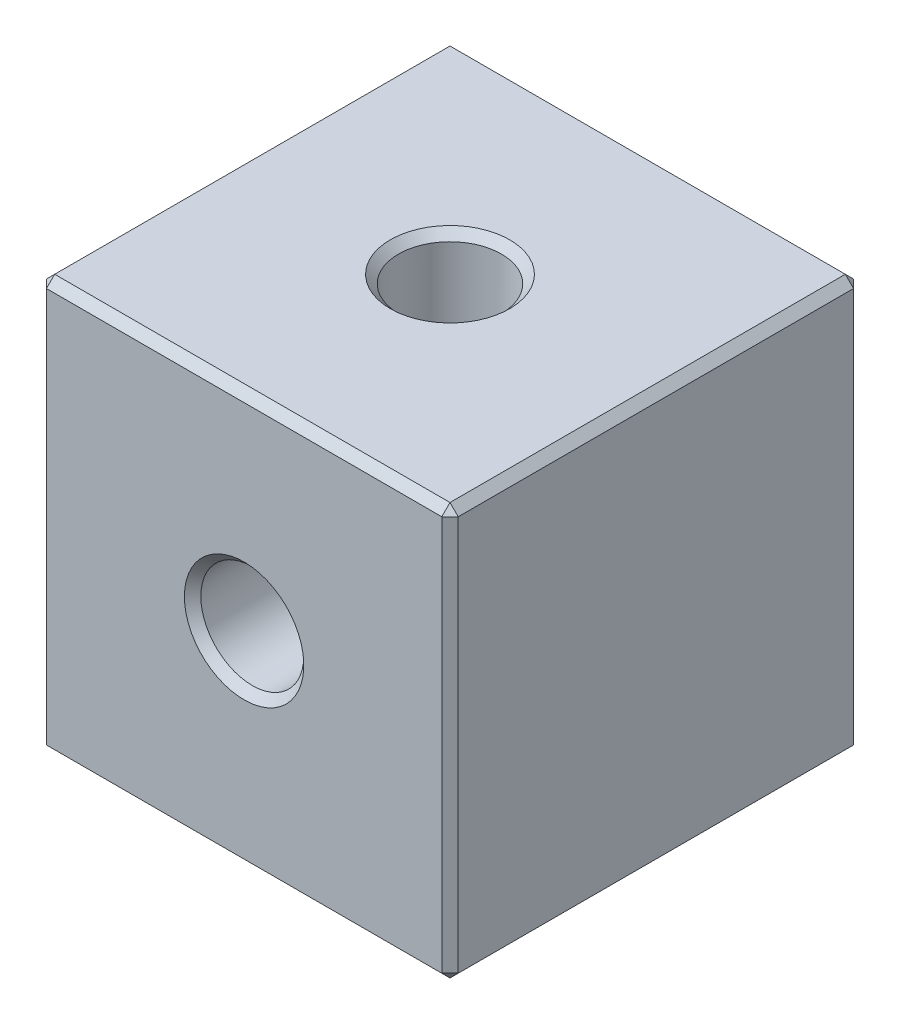
ISO-10303-21;
HEADER;
FILE_DESCRIPTION(('STEP AP214'),'2;1');
FILE_NAME('part.step','',(''),(''),'','','');
FILE_SCHEMA(('AUTOMOTIVE_DESIGN { 1 0 10303 214 1 1 1 1 }'));
ENDSEC;
DATA;
#1=APPLICATION_CONTEXT('core data for automotive mechanical design processes');
#2=APPLICATION_PROTOCOL_DEFINITION('international standard','automotive_design',2000,#1);
#3=PRODUCT_CONTEXT('',#1,'mechanical');
#4=PRODUCT('Part','Part','',(#3));
#5=PRODUCT_RELATED_PRODUCT_CATEGORY('part','',(#4));
#6=PRODUCT_DEFINITION_FORMATION('','',#4);
#7=PRODUCT_DEFINITION_CONTEXT('part definition',#1,'design');
#8=PRODUCT_DEFINITION('design','',#6,#7);
#9=PRODUCT_DEFINITION_SHAPE('','',#8);
#10=(LENGTH_UNIT() NAMED_UNIT(*) SI_UNIT(.MILLI.,.METRE.));
#11=(NAMED_UNIT(*) PLANE_ANGLE_UNIT() SI_UNIT($,.RADIAN.));
#12=(NAMED_UNIT(*) SI_UNIT($,.STERADIAN.) SOLID_ANGLE_UNIT());
#13=UNCERTAINTY_MEASURE_WITH_UNIT(LENGTH_MEASURE(1.E-05),#10,'distance_accuracy_value','');
#14=(GEOMETRIC_REPRESENTATION_CONTEXT(3) GLOBAL_UNCERTAINTY_ASSIGNED_CONTEXT((#13)) GLOBAL_UNIT_ASSIGNED_CONTEXT((#10,
#11,#12)) REPRESENTATION_CONTEXT('',''));
#15=CARTESIAN_POINT('',(0.,0.,0.));
#16=DIRECTION('',(0.,0.,1.));
#17=DIRECTION('',(1.,0.,0.));
#18=AXIS2_PLACEMENT_3D('',#15,#16,#17);
#19=CARTESIAN_POINT('',(5.,5.,-5.));
#20=DIRECTION('',(-1.,0.,0.));
#21=DIRECTION('',(0.,0.,1.));
#22=AXIS2_PLACEMENT_3D('',#19,#20,#21);
#23=PLANE('',#22);
#24=DIRECTION('',(0.,0.,-1.));
#25=VECTOR('',#24,1.);
#26=CARTESIAN_POINT('',(5.,-4.8,-5.));
#27=LINE('',#26,#25);
#28=CARTESIAN_POINT('',(5.,-4.8,4.8));
#29=VERTEX_POINT('',#28);
#30=CARTESIAN_POINT('',(5.,-4.8,-4.8));
#31=VERTEX_POINT('',#30);
#32=EDGE_CURVE('E220',#29,#31,#27,.T.);
#33=ORIENTED_EDGE('',*,*,#32,.T.);
#34=DIRECTION('',(0.,1.,0.));
#35=VECTOR('',#34,1.);
#36=CARTESIAN_POINT('',(5.,5.,-4.8));
#37=LINE('',#36,#35);
#38=CARTESIAN_POINT('',(5.,4.8,-4.8));
#39=VERTEX_POINT('',#38);
#40=EDGE_CURVE('E222',#31,#39,#37,.T.);
#41=ORIENTED_EDGE('',*,*,#40,.T.);
#42=DIRECTION('',(0.,0.,1.));
#43=VECTOR('',#42,1.);
#44=CARTESIAN_POINT('',(5.,4.8,5.));
#45=LINE('',#44,#43);
#46=CARTESIAN_POINT('',(5.,4.8,4.8));
#47=VERTEX_POINT('',#46);
#48=EDGE_CURVE('E216',#39,#47,#45,.T.);
#49=ORIENTED_EDGE('',*,*,#48,.T.);
#50=DIRECTION('',(0.,-1.,0.));
#51=VECTOR('',#50,1.);
#52=CARTESIAN_POINT('',(5.,5.,4.8));
#53=LINE('',#52,#51);
#54=EDGE_CURVE('E218',#47,#29,#53,.T.);
#55=ORIENTED_EDGE('',*,*,#54,.T.);
#56=EDGE_LOOP('',(#33,#41,#49,#55));
#57=FACE_BOUND('',#56,.T.);
#58=ADVANCED_FACE('F41',(#57),#23,.F.);
#59=CARTESIAN_POINT('',(-5.,5.,-5.));
#60=DIRECTION('',(0.,0.,1.));
#61=DIRECTION('',(1.,0.,0.));
#62=AXIS2_PLACEMENT_3D('',#59,#60,#61);
#63=PLANE('',#62);
#64=DIRECTION('',(-1.,0.,0.));
#65=VECTOR('',#64,1.);
#66=CARTESIAN_POINT('',(-5.,-4.8,-5.));
#67=LINE('',#66,#65);
#68=CARTESIAN_POINT('',(4.8,-4.8,-5.));
#69=VERTEX_POINT('',#68);
#70=CARTESIAN_POINT('',(-4.8,-4.8,-5.));
#71=VERTEX_POINT('',#70);
#72=EDGE_CURVE('E211',#69,#71,#67,.T.);
#73=ORIENTED_EDGE('',*,*,#72,.T.);
#74=DIRECTION('',(0.,1.,0.));
#75=VECTOR('',#74,1.);
#76=CARTESIAN_POINT('',(-4.8,5.,-5.));
#77=LINE('',#76,#75);
#78=CARTESIAN_POINT('',(-4.8,4.8,-5.));
#79=VERTEX_POINT('',#78);
#80=EDGE_CURVE('E213',#71,#79,#77,.T.);
#81=ORIENTED_EDGE('',*,*,#80,.T.);
#82=DIRECTION('',(1.,0.,0.));
#83=VECTOR('',#82,1.);
#84=CARTESIAN_POINT('',(5.,4.8,-5.));
#85=LINE('',#84,#83);
#86=CARTESIAN_POINT('',(4.8,4.8,-5.));
#87=VERTEX_POINT('',#86);
#88=EDGE_CURVE('E207',#79,#87,#85,.T.);
#89=ORIENTED_EDGE('',*,*,#88,.T.);
#90=DIRECTION('',(0.,-1.,0.));
#91=VECTOR('',#90,1.);
#92=CARTESIAN_POINT('',(4.8,5.,-5.));
#93=LINE('',#92,#91);
#94=EDGE_CURVE('E209',#87,#69,#93,.T.);
#95=ORIENTED_EDGE('',*,*,#94,.T.);
#96=EDGE_LOOP('',(#73,#81,#89,#95));
#97=FACE_BOUND('',#96,.T.);
#98=ADVANCED_FACE('F331',(#97),#63,.F.);
#99=CARTESIAN_POINT('',(-5.,5.,-5.));
#100=DIRECTION('',(1.,0.,0.));
#101=DIRECTION('',(0.,0.,-1.));
#102=AXIS2_PLACEMENT_3D('',#99,#100,#101);
#103=PLANE('',#102);
#104=CARTESIAN_POINT('',(-5.,0.,0.));
#105=DIRECTION('',(1.,0.,0.));
#106=DIRECTION('',(0.,0.,-1.));
#107=AXIS2_PLACEMENT_3D('',#104,#105,#106);
#108=CIRCLE('',#107,1.45);
#109=CARTESIAN_POINT('',(-5.,0.,-1.45));
#110=VERTEX_POINT('',#109);
#111=EDGE_CURVE('E180',#110,#110,#108,.T.);
#112=ORIENTED_EDGE('',*,*,#111,.T.);
#113=EDGE_LOOP('',(#112));
#114=FACE_BOUND('',#113,.T.);
#115=DIRECTION('',(0.,-1.,0.));
#116=VECTOR('',#115,1.);
#117=CARTESIAN_POINT('',(-5.,5.,-4.8));
#118=LINE('',#117,#116);
#119=CARTESIAN_POINT('',(-5.,4.8,-4.8));
#120=VERTEX_POINT('',#119);
#121=CARTESIAN_POINT('',(-5.,-4.8,-4.8));
#122=VERTEX_POINT('',#121);
#123=EDGE_CURVE('E175',#120,#122,#118,.T.);
#124=ORIENTED_EDGE('',*,*,#123,.T.);
#125=DIRECTION('',(0.,0.,1.));
#126=VECTOR('',#125,1.);
#127=CARTESIAN_POINT('',(-5.,-4.8,-5.));
#128=LINE('',#127,#126);
#129=CARTESIAN_POINT('',(-5.,-4.8,4.8));
#130=VERTEX_POINT('',#129);
#131=EDGE_CURVE('E177',#122,#130,#128,.T.);
#132=ORIENTED_EDGE('',*,*,#131,.T.);
#133=DIRECTION('',(0.,1.,0.));
#134=VECTOR('',#133,1.);
#135=CARTESIAN_POINT('',(-5.,5.,4.8));
#136=LINE('',#135,#134);
#137=CARTESIAN_POINT('',(-5.,4.8,4.8));
#138=VERTEX_POINT('',#137);
#139=EDGE_CURVE('E173',#130,#138,#136,.T.);
#140=ORIENTED_EDGE('',*,*,#139,.T.);
#141=DIRECTION('',(0.,0.,-1.));
#142=VECTOR('',#141,1.);
#143=CARTESIAN_POINT('',(-5.,4.8,-5.));
#144=LINE('',#143,#142);
#145=EDGE_CURVE('E171',#138,#120,#144,.T.);
#146=ORIENTED_EDGE('',*,*,#145,.T.);
#147=EDGE_LOOP('',(#124,#132,#140,#146));
#148=FACE_BOUND('',#147,.T.);
#149=ADVANCED_FACE('F363',(#114,#148),#103,.F.);
#150=CARTESIAN_POINT('',(-5.,5.,5.));
#151=DIRECTION('',(0.,0.,-1.));
#152=DIRECTION('',(-1.,0.,0.));
#153=AXIS2_PLACEMENT_3D('',#150,#151,#152);
#154=PLANE('',#153);
#155=CARTESIAN_POINT('',(0.,0.,5.));
#156=DIRECTION('',(0.,0.,-1.));
#157=DIRECTION('',(-1.,0.,0.));
#158=AXIS2_PLACEMENT_3D('',#155,#156,#157);
#159=CIRCLE('',#158,1.44999999999999);
#160=CARTESIAN_POINT('',(-1.44999999999999,0.,5.));
#161=VERTEX_POINT('',#160);
#162=EDGE_CURVE('E195',#161,#161,#159,.T.);
#163=ORIENTED_EDGE('',*,*,#162,.T.);
#164=EDGE_LOOP('',(#163));
#165=FACE_BOUND('',#164,.T.);
#166=DIRECTION('',(-1.,0.,0.));
#167=VECTOR('',#166,1.);
#168=CARTESIAN_POINT('',(-5.,4.8,5.));
#169=LINE('',#168,#167);
#170=CARTESIAN_POINT('',(4.8,4.8,5.));
#171=VERTEX_POINT('',#170);
#172=CARTESIAN_POINT('',(-4.8,4.8,5.));
#173=VERTEX_POINT('',#172);
#174=EDGE_CURVE('E186',#171,#173,#169,.T.);
#175=ORIENTED_EDGE('',*,*,#174,.T.);
#176=DIRECTION('',(0.,-1.,0.));
#177=VECTOR('',#176,1.);
#178=CARTESIAN_POINT('',(-4.8,5.,5.));
#179=LINE('',#178,#177);
#180=CARTESIAN_POINT('',(-4.8,-4.8,5.));
#181=VERTEX_POINT('',#180);
#182=EDGE_CURVE('E192',#173,#181,#179,.T.);
#183=ORIENTED_EDGE('',*,*,#182,.T.);
#184=DIRECTION('',(1.,0.,0.));
#185=VECTOR('',#184,1.);
#186=CARTESIAN_POINT('',(-5.,-4.8,5.));
#187=LINE('',#186,#185);
#188=CARTESIAN_POINT('',(4.8,-4.8,5.));
#189=VERTEX_POINT('',#188);
#190=EDGE_CURVE('E190',#181,#189,#187,.T.);
#191=ORIENTED_EDGE('',*,*,#190,.T.);
#192=DIRECTION('',(0.,1.,0.));
#193=VECTOR('',#192,1.);
#194=CARTESIAN_POINT('',(4.8,5.,5.));
#195=LINE('',#194,#193);
#196=EDGE_CURVE('E188',#189,#171,#195,.T.);
#197=ORIENTED_EDGE('',*,*,#196,.T.);
#198=EDGE_LOOP('',(#175,#183,#191,#197));
#199=FACE_BOUND('',#198,.T.);
#200=ADVANCED_FACE('F518',(#165,#199),#154,.F.);
#201=CARTESIAN_POINT('',(0.,5.,0.));
#202=DIRECTION('',(0.,1.,0.));
#203=DIRECTION('',(0.,0.,1.));
#204=AXIS2_PLACEMENT_3D('',#201,#202,#203);
#205=PLANE('',#204);
#206=DIRECTION('',(0.,0.,1.));
#207=VECTOR('',#206,1.);
#208=CARTESIAN_POINT('',(-4.8,5.,5.));
#209=LINE('',#208,#207);
#210=CARTESIAN_POINT('',(-4.80000000000001,5.,-4.8));
#211=VERTEX_POINT('',#210);
#212=CARTESIAN_POINT('',(-4.8,5.,4.8));
#213=VERTEX_POINT('',#212);
#214=EDGE_CURVE('E59',#211,#213,#209,.T.);
#215=ORIENTED_EDGE('',*,*,#214,.T.);
#216=DIRECTION('',(1.,0.,0.));
#217=VECTOR('',#216,1.);
#218=CARTESIAN_POINT('',(5.,5.,4.8));
#219=LINE('',#218,#217);
#220=CARTESIAN_POINT('',(4.8,5.,4.8));
#221=VERTEX_POINT('',#220);
#222=EDGE_CURVE('E51',#213,#221,#219,.T.);
#223=ORIENTED_EDGE('',*,*,#222,.T.);
#224=DIRECTION('',(0.,0.,-1.));
#225=VECTOR('',#224,1.);
#226=CARTESIAN_POINT('',(4.8,5.,-5.));
#227=LINE('',#226,#225);
#228=CARTESIAN_POINT('',(4.8,5.,-4.8));
#229=VERTEX_POINT('',#228);
#230=EDGE_CURVE('E228',#221,#229,#227,.T.);
#231=ORIENTED_EDGE('',*,*,#230,.T.);
#232=DIRECTION('',(-1.,0.,0.));
#233=VECTOR('',#232,1.);
#234=CARTESIAN_POINT('',(-5.,5.,-4.8));
#235=LINE('',#234,#233);
#236=EDGE_CURVE('E64',#229,#211,#235,.T.);
#237=ORIENTED_EDGE('',*,*,#236,.T.);
#238=EDGE_LOOP('',(#215,#223,#231,#237));
#239=FACE_BOUND('',#238,.T.);
#240=CARTESIAN_POINT('',(0.,5.,0.));
#241=DIRECTION('',(0.,1.,0.));
#242=DIRECTION('',(0.,0.,1.));
#243=AXIS2_PLACEMENT_3D('',#240,#241,#242);
#244=CIRCLE('',#243,1.44999999999999);
#245=CARTESIAN_POINT('',(0.,5.,1.44999999999999));
#246=VERTEX_POINT('',#245);
#247=EDGE_CURVE('E225',#246,#246,#244,.F.);
#248=ORIENTED_EDGE('',*,*,#247,.T.);
#249=EDGE_LOOP('',(#248));
#250=FACE_BOUND('',#249,.T.);
#251=ADVANCED_FACE('F515',(#239,#250),#205,.T.);
#252=CARTESIAN_POINT('',(0.,-5.,0.));
#253=DIRECTION('',(0.,1.,0.));
#254=DIRECTION('',(0.,0.,1.));
#255=AXIS2_PLACEMENT_3D('',#252,#253,#254);
#256=PLANE('',#255);
#257=DIRECTION('',(-1.,0.,0.));
#258=VECTOR('',#257,1.);
#259=CARTESIAN_POINT('',(0.,-5.,4.8));
#260=LINE('',#259,#258);
#261=CARTESIAN_POINT('',(4.8,-5.,4.8));
#262=VERTEX_POINT('',#261);
#263=CARTESIAN_POINT('',(-4.8,-5.,4.8));
#264=VERTEX_POINT('',#263);
#265=EDGE_CURVE('E198',#262,#264,#260,.T.);
#266=ORIENTED_EDGE('',*,*,#265,.T.);
#267=DIRECTION('',(0.,0.,-1.));
#268=VECTOR('',#267,1.);
#269=CARTESIAN_POINT('',(-4.8,-5.,0.));
#270=LINE('',#269,#268);
#271=CARTESIAN_POINT('',(-4.8,-5.,-4.8));
#272=VERTEX_POINT('',#271);
#273=EDGE_CURVE('E204',#264,#272,#270,.T.);
#274=ORIENTED_EDGE('',*,*,#273,.T.);
#275=DIRECTION('',(1.,0.,0.));
#276=VECTOR('',#275,1.);
#277=CARTESIAN_POINT('',(0.,-5.,-4.8));
#278=LINE('',#277,#276);
#279=CARTESIAN_POINT('',(4.8,-5.,-4.8));
#280=VERTEX_POINT('',#279);
#281=EDGE_CURVE('E202',#272,#280,#278,.T.);
#282=ORIENTED_EDGE('',*,*,#281,.T.);
#283=DIRECTION('',(0.,0.,1.));
#284=VECTOR('',#283,1.);
#285=CARTESIAN_POINT('',(4.8,-5.,0.));
#286=LINE('',#285,#284);
#287=EDGE_CURVE('E200',#280,#262,#286,.T.);
#288=ORIENTED_EDGE('',*,*,#287,.T.);
#289=EDGE_LOOP('',(#266,#274,#282,#288));
#290=FACE_BOUND('',#289,.T.);
#291=ADVANCED_FACE('F504',(#290),#256,.F.);
#292=CARTESIAN_POINT('',(0.,0.,5.));
#293=DIRECTION('',(0.,0.,1.));
#294=DIRECTION('',(1.,0.,0.));
#295=AXIS2_PLACEMENT_3D('',#292,#293,#294);
#296=CYLINDRICAL_SURFACE('',#295,1.24999999999999);
#297=CARTESIAN_POINT('',(0.,0.,4.80000000000001));
#298=DIRECTION('',(0.,0.,-1.));
#299=DIRECTION('',(-1.,0.,0.));
#300=AXIS2_PLACEMENT_3D('',#297,#298,#299);
#301=CIRCLE('',#300,1.24999999999999);
#302=CARTESIAN_POINT('',(-1.24999999999999,0.,4.80000000000001));
#303=VERTEX_POINT('',#302);
#304=EDGE_CURVE('E183',#303,#303,#301,.F.);
#305=ORIENTED_EDGE('',*,*,#304,.T.);
#306=EDGE_LOOP('',(#305));
#307=FACE_BOUND('',#306,.T.);
#308=CARTESIAN_POINT('',(0.,0.,0.));
#309=DIRECTION('',(0.,0.,1.));
#310=DIRECTION('',(1.,0.,0.));
#311=AXIS2_PLACEMENT_3D('',#308,#309,#310);
#312=CIRCLE('',#311,1.24999999999999);
#313=CARTESIAN_POINT('',(1.24999999999999,0.,0.));
#314=VERTEX_POINT('',#313);
#315=CARTESIAN_POINT('',(0.,-1.24999999999999,0.));
#316=VERTEX_POINT('',#315);
#317=EDGE_CURVE('E147',#314,#316,#312,.F.);
#318=ORIENTED_EDGE('',*,*,#317,.T.);
#319=CARTESIAN_POINT('',(0.,0.,0.));
#320=DIRECTION('',(0.707106781186548,0.,0.707106781186547));
#321=DIRECTION('',(-0.707106781186547,0.,0.707106781186547));
#322=AXIS2_PLACEMENT_3D('',#319,#320,#321);
#323=ELLIPSE('',#322,1.76776695296636,1.25);
#324=CARTESIAN_POINT('',(-0.883883476483181,0.883883476483181,0.883883476483181));
#325=VERTEX_POINT('',#324);
#326=EDGE_CURVE('E153',#316,#325,#323,.F.);
#327=ORIENTED_EDGE('',*,*,#326,.T.);
#328=CARTESIAN_POINT('',(0.,0.,0.));
#329=DIRECTION('',(0.,-0.707106781186547,0.707106781186547));
#330=DIRECTION('',(0.,0.707106781186547,0.707106781186547));
#331=AXIS2_PLACEMENT_3D('',#328,#329,#330);
#332=ELLIPSE('',#331,1.76776695296636,1.24999999999999);
#333=EDGE_CURVE('E162',#325,#314,#332,.F.);
#334=ORIENTED_EDGE('',*,*,#333,.T.);
#335=EDGE_LOOP('',(#318,#327,#334));
#336=FACE_BOUND('',#335,.T.);
#337=ADVANCED_FACE('F161',(#307,#336),#296,.F.);
#338=CARTESIAN_POINT('',(0.,5.,0.));
#339=DIRECTION('',(0.,1.,0.));
#340=DIRECTION('',(0.,0.,1.));
#341=AXIS2_PLACEMENT_3D('',#338,#339,#340);
#342=CYLINDRICAL_SURFACE('',#341,1.24999999999999);
#343=CARTESIAN_POINT('',(0.,4.80000000000001,0.));
#344=DIRECTION('',(0.,1.,0.));
#345=DIRECTION('',(0.,0.,1.));
#346=AXIS2_PLACEMENT_3D('',#343,#344,#345);
#347=CIRCLE('',#346,1.24999999999999);
#348=CARTESIAN_POINT('',(0.,4.80000000000001,1.24999999999999));
#349=VERTEX_POINT('',#348);
#350=EDGE_CURVE('E11',#349,#349,#347,.T.);
#351=ORIENTED_EDGE('',*,*,#350,.T.);
#352=EDGE_LOOP('',(#351));
#353=FACE_BOUND('',#352,.T.);
#354=ORIENTED_EDGE('',*,*,#333,.F.);
#355=CARTESIAN_POINT('',(0.,0.,0.));
#356=DIRECTION('',(0.707106781186547,0.707106781186547,0.));
#357=DIRECTION('',(-0.707106781186547,0.707106781186547,0.));
#358=AXIS2_PLACEMENT_3D('',#355,#356,#357);
#359=ELLIPSE('',#358,1.76776695296636,1.25);
#360=CARTESIAN_POINT('',(0.,0.,-1.25));
#361=VERTEX_POINT('',#360);
#362=EDGE_CURVE('E157',#325,#361,#359,.F.);
#363=ORIENTED_EDGE('',*,*,#362,.T.);
#364=CARTESIAN_POINT('',(0.,0.,0.));
#365=DIRECTION('',(0.,1.,0.));
#366=DIRECTION('',(0.,0.,1.));
#367=AXIS2_PLACEMENT_3D('',#364,#365,#366);
#368=CIRCLE('',#367,1.24999999999999);
#369=EDGE_CURVE('E150',#361,#314,#368,.F.);
#370=ORIENTED_EDGE('',*,*,#369,.T.);
#371=EDGE_LOOP('',(#354,#363,#370));
#372=FACE_BOUND('',#371,.T.);
#373=ADVANCED_FACE('F526',(#353,#372),#342,.F.);
#374=CARTESIAN_POINT('',(-5.,0.,0.));
#375=DIRECTION('',(-1.,0.,0.));
#376=DIRECTION('',(0.,0.,1.));
#377=AXIS2_PLACEMENT_3D('',#374,#375,#376);
#378=CYLINDRICAL_SURFACE('',#377,1.25);
#379=CARTESIAN_POINT('',(-4.8,0.,0.));
#380=DIRECTION('',(1.,0.,0.));
#381=DIRECTION('',(0.,0.,-1.));
#382=AXIS2_PLACEMENT_3D('',#379,#380,#381);
#383=CIRCLE('',#382,1.25);
#384=CARTESIAN_POINT('',(-4.8,0.,-1.25));
#385=VERTEX_POINT('',#384);
#386=EDGE_CURVE('E164',#385,#385,#383,.F.);
#387=ORIENTED_EDGE('',*,*,#386,.T.);
#388=EDGE_LOOP('',(#387));
#389=FACE_BOUND('',#388,.T.);
#390=CARTESIAN_POINT('',(0.,0.,0.));
#391=DIRECTION('',(1.,0.,0.));
#392=DIRECTION('',(0.,0.,-1.));
#393=AXIS2_PLACEMENT_3D('',#390,#391,#392);
#394=CIRCLE('',#393,1.25);
#395=EDGE_CURVE('E143',#361,#316,#394,.F.);
#396=ORIENTED_EDGE('',*,*,#395,.F.);
#397=ORIENTED_EDGE('',*,*,#362,.F.);
#398=ORIENTED_EDGE('',*,*,#326,.F.);
#399=EDGE_LOOP('',(#396,#397,#398));
#400=FACE_BOUND('',#399,.T.);
#401=ADVANCED_FACE('F156',(#389,#400),#378,.F.);
#402=CARTESIAN_POINT('',(0.,0.,0.));
#403=DIRECTION('',(1.,0.,0.));
#404=DIRECTION('',(0.,0.,1.));
#405=AXIS2_PLACEMENT_3D('',#402,#403,#404);
#406=SPHERICAL_SURFACE('',#405,1.24999999999999);
#407=ORIENTED_EDGE('',*,*,#317,.F.);
#408=ORIENTED_EDGE('',*,*,#369,.F.);
#409=ORIENTED_EDGE('',*,*,#395,.T.);
#410=EDGE_LOOP('',(#407,#408,#409));
#411=FACE_BOUND('',#410,.T.);
#412=ADVANCED_FACE('F145',(#411),#406,.F.);
#413=CARTESIAN_POINT('',(-4.8,0.,0.));
#414=DIRECTION('',(-1.,0.,0.));
#415=DIRECTION('',(0.,0.,1.));
#416=AXIS2_PLACEMENT_3D('',#413,#414,#415);
#417=CONICAL_SURFACE('',#416,1.25,0.78539816339745);
#418=ORIENTED_EDGE('',*,*,#111,.F.);
#419=EDGE_LOOP('',(#418));
#420=FACE_BOUND('',#419,.T.);
#421=ORIENTED_EDGE('',*,*,#386,.F.);
#422=EDGE_LOOP('',(#421));
#423=FACE_BOUND('',#422,.T.);
#424=ADVANCED_FACE('F368',(#420,#423),#417,.F.);
#425=CARTESIAN_POINT('',(0.,0.,4.80000000000001));
#426=DIRECTION('',(0.,0.,1.));
#427=DIRECTION('',(1.,0.,0.));
#428=AXIS2_PLACEMENT_3D('',#425,#426,#427);
#429=CONICAL_SURFACE('',#428,1.24999999999999,0.785398163397454);
#430=ORIENTED_EDGE('',*,*,#162,.F.);
#431=EDGE_LOOP('',(#430));
#432=FACE_BOUND('',#431,.T.);
#433=ORIENTED_EDGE('',*,*,#304,.F.);
#434=EDGE_LOOP('',(#433));
#435=FACE_BOUND('',#434,.T.);
#436=ADVANCED_FACE('F374',(#432,#435),#429,.F.);
#437=CARTESIAN_POINT('',(4.8,5.,0.));
#438=DIRECTION('',(0.707106781186554,0.707106781186541,0.));
#439=DIRECTION('',(0.,0.,1.));
#440=AXIS2_PLACEMENT_3D('',#437,#438,#439);
#441=PLANE('',#440);
#442=DIRECTION('',(0.707106781186541,-0.707106781186555,0.));
#443=VECTOR('',#442,1.);
#444=CARTESIAN_POINT('',(5.,4.8,-4.8));
#445=LINE('',#444,#443);
#446=EDGE_CURVE('E46',#229,#39,#445,.T.);
#447=ORIENTED_EDGE('',*,*,#446,.F.);
#448=ORIENTED_EDGE('',*,*,#230,.F.);
#449=DIRECTION('',(-0.70710678118654,0.707106781186554,0.));
#450=VECTOR('',#449,1.);
#451=CARTESIAN_POINT('',(4.9,4.9,4.8));
#452=LINE('',#451,#450);
#453=EDGE_CURVE('E292',#47,#221,#452,.T.);
#454=ORIENTED_EDGE('',*,*,#453,.F.);
#455=ORIENTED_EDGE('',*,*,#48,.F.);
#456=EDGE_LOOP('',(#447,#448,#454,#455));
#457=FACE_BOUND('',#456,.T.);
#458=ADVANCED_FACE('F308',(#457),#441,.T.);
#459=CARTESIAN_POINT('',(5.,4.8,-4.8));
#460=DIRECTION('',(0.577350269189637,0.577350269189615,-0.577350269189625));
#461=DIRECTION('',(-0.70710678118654,0.,-0.707106781186555));
#462=AXIS2_PLACEMENT_3D('',#459,#460,#461);
#463=PLANE('',#462);
#464=DIRECTION('',(0.,0.707106781186554,0.707106781186541));
#465=VECTOR('',#464,1.);
#466=CARTESIAN_POINT('',(4.8,4.9,-4.9));
#467=LINE('',#466,#465);
#468=EDGE_CURVE('E288',#229,#87,#467,.F.);
#469=ORIENTED_EDGE('',*,*,#468,.F.);
#470=ORIENTED_EDGE('',*,*,#446,.T.);
#471=DIRECTION('',(0.70710678118654,0.,0.707106781186555));
#472=VECTOR('',#471,1.);
#473=CARTESIAN_POINT('',(5.,4.8,-4.8));
#474=LINE('',#473,#472);
#475=EDGE_CURVE('E291',#87,#39,#474,.T.);
#476=ORIENTED_EDGE('',*,*,#475,.F.);
#477=EDGE_LOOP('',(#469,#470,#476));
#478=FACE_BOUND('',#477,.T.);
#479=ADVANCED_FACE('F305',(#478),#463,.T.);
#480=CARTESIAN_POINT('',(4.8,4.8,5.));
#481=DIRECTION('',(0.577350269189637,0.577350269189615,0.577350269189625));
#482=DIRECTION('',(0.70710678118654,0.,-0.707106781186555));
#483=AXIS2_PLACEMENT_3D('',#480,#481,#482);
#484=PLANE('',#483);
#485=DIRECTION('',(-0.70710678118654,0.,0.707106781186555));
#486=VECTOR('',#485,1.);
#487=CARTESIAN_POINT('',(4.8,4.8,5.));
#488=LINE('',#487,#486);
#489=EDGE_CURVE('E283',#47,#171,#488,.T.);
#490=ORIENTED_EDGE('',*,*,#489,.F.);
#491=ORIENTED_EDGE('',*,*,#453,.T.);
#492=DIRECTION('',(0.,-0.707106781186554,0.707106781186541));
#493=VECTOR('',#492,1.);
#494=CARTESIAN_POINT('',(4.8,4.8,5.));
#495=LINE('',#494,#493);
#496=EDGE_CURVE('E286',#171,#221,#495,.F.);
#497=ORIENTED_EDGE('',*,*,#496,.F.);
#498=EDGE_LOOP('',(#490,#491,#497));
#499=FACE_BOUND('',#498,.T.);
#500=ADVANCED_FACE('F355',(#499),#484,.T.);
#501=CARTESIAN_POINT('',(4.8,5.,-5.));
#502=DIRECTION('',(-0.707106781186555,0.,0.70710678118654));
#503=DIRECTION('',(0.,-1.,0.));
#504=AXIS2_PLACEMENT_3D('',#501,#502,#503);
#505=PLANE('',#504);
#506=ORIENTED_EDGE('',*,*,#475,.T.);
#507=ORIENTED_EDGE('',*,*,#40,.F.);
#508=DIRECTION('',(-0.70710678118654,0.,-0.707106781186555));
#509=VECTOR('',#508,1.);
#510=CARTESIAN_POINT('',(4.9,-4.8,-4.9));
#511=LINE('',#510,#509);
#512=EDGE_CURVE('E277',#69,#31,#511,.F.);
#513=ORIENTED_EDGE('',*,*,#512,.F.);
#514=ORIENTED_EDGE('',*,*,#94,.F.);
#515=EDGE_LOOP('',(#506,#507,#513,#514));
#516=FACE_BOUND('',#515,.T.);
#517=ADVANCED_FACE('F315',(#516),#505,.F.);
#518=CARTESIAN_POINT('',(0.,5.,-4.8));
#519=DIRECTION('',(0.,0.707106781186541,-0.707106781186554));
#520=DIRECTION('',(1.,0.,0.));
#521=AXIS2_PLACEMENT_3D('',#518,#519,#520);
#522=PLANE('',#521);
#523=ORIENTED_EDGE('',*,*,#468,.T.);
#524=ORIENTED_EDGE('',*,*,#88,.F.);
#525=DIRECTION('',(0.,-0.707106781186553,-0.707106781186541));
#526=VECTOR('',#525,1.);
#527=CARTESIAN_POINT('',(-4.8,4.8,-5.));
#528=LINE('',#527,#526);
#529=EDGE_CURVE('E274',#211,#79,#528,.T.);
#530=ORIENTED_EDGE('',*,*,#529,.F.);
#531=ORIENTED_EDGE('',*,*,#236,.F.);
#532=EDGE_LOOP('',(#523,#524,#530,#531));
#533=FACE_BOUND('',#532,.T.);
#534=ADVANCED_FACE('F344',(#533),#522,.T.);
#535=CARTESIAN_POINT('',(-4.8,5.,0.));
#536=DIRECTION('',(-0.707106781186554,0.707106781186541,0.));
#537=DIRECTION('',(0.,0.,-1.));
#538=AXIS2_PLACEMENT_3D('',#535,#536,#537);
#539=PLANE('',#538);
#540=DIRECTION('',(-0.707106781186541,-0.707106781186554,0.));
#541=VECTOR('',#540,1.);
#542=CARTESIAN_POINT('',(-5.,4.8,4.8));
#543=LINE('',#542,#541);
#544=EDGE_CURVE('E268',#213,#138,#543,.T.);
#545=ORIENTED_EDGE('',*,*,#544,.F.);
#546=ORIENTED_EDGE('',*,*,#214,.F.);
#547=DIRECTION('',(0.707106781186541,0.707106781186554,0.));
#548=VECTOR('',#547,1.);
#549=CARTESIAN_POINT('',(-4.9,4.9,-4.8));
#550=LINE('',#549,#548);
#551=EDGE_CURVE('E271',#120,#211,#550,.T.);
#552=ORIENTED_EDGE('',*,*,#551,.F.);
#553=ORIENTED_EDGE('',*,*,#145,.F.);
#554=EDGE_LOOP('',(#545,#546,#552,#553));
#555=FACE_BOUND('',#554,.T.);
#556=ADVANCED_FACE('F346',(#555),#539,.T.);
#557=CARTESIAN_POINT('',(0.,5.,4.8));
#558=DIRECTION('',(0.,0.707106781186541,0.707106781186554));
#559=DIRECTION('',(-1.,0.,0.));
#560=AXIS2_PLACEMENT_3D('',#557,#558,#559);
#561=PLANE('',#560);
#562=ORIENTED_EDGE('',*,*,#496,.T.);
#563=ORIENTED_EDGE('',*,*,#222,.F.);
#564=DIRECTION('',(0.,0.707106781186554,-0.707106781186541));
#565=VECTOR('',#564,1.);
#566=CARTESIAN_POINT('',(-4.8,4.9,4.9));
#567=LINE('',#566,#565);
#568=EDGE_CURVE('E265',#173,#213,#567,.T.);
#569=ORIENTED_EDGE('',*,*,#568,.F.);
#570=ORIENTED_EDGE('',*,*,#174,.F.);
#571=EDGE_LOOP('',(#562,#563,#569,#570));
#572=FACE_BOUND('',#571,.T.);
#573=ADVANCED_FACE('F352',(#572),#561,.T.);
#574=CARTESIAN_POINT('',(5.,5.,4.8));
#575=DIRECTION('',(-0.707106781186555,0.,-0.70710678118654));
#576=DIRECTION('',(0.,-1.,0.));
#577=AXIS2_PLACEMENT_3D('',#574,#575,#576);
#578=PLANE('',#577);
#579=ORIENTED_EDGE('',*,*,#489,.T.);
#580=ORIENTED_EDGE('',*,*,#196,.F.);
#581=DIRECTION('',(0.70710678118654,0.,-0.707106781186555));
#582=VECTOR('',#581,1.);
#583=CARTESIAN_POINT('',(4.9,-4.8,4.9));
#584=LINE('',#583,#582);
#585=EDGE_CURVE('E262',#29,#189,#584,.F.);
#586=ORIENTED_EDGE('',*,*,#585,.F.);
#587=ORIENTED_EDGE('',*,*,#54,.F.);
#588=EDGE_LOOP('',(#579,#580,#586,#587));
#589=FACE_BOUND('',#588,.T.);
#590=ADVANCED_FACE('F457',(#589),#578,.F.);
#591=CARTESIAN_POINT('',(5.,-4.8,-5.));
#592=DIRECTION('',(-0.707106781186554,0.707106781186541,0.));
#593=DIRECTION('',(0.,0.,-1.));
#594=AXIS2_PLACEMENT_3D('',#591,#592,#593);
#595=PLANE('',#594);
#596=DIRECTION('',(0.707106781186541,0.707106781186554,0.));
#597=VECTOR('',#596,1.);
#598=CARTESIAN_POINT('',(4.8,-5.,-4.8));
#599=LINE('',#598,#597);
#600=EDGE_CURVE('E280',#31,#280,#599,.F.);
#601=ORIENTED_EDGE('',*,*,#600,.F.);
#602=ORIENTED_EDGE('',*,*,#32,.F.);
#603=DIRECTION('',(-0.70710678118654,-0.707106781186554,0.));
#604=VECTOR('',#603,1.);
#605=CARTESIAN_POINT('',(4.8,-5.,4.8));
#606=LINE('',#605,#604);
#607=EDGE_CURVE('E259',#262,#29,#606,.F.);
#608=ORIENTED_EDGE('',*,*,#607,.F.);
#609=ORIENTED_EDGE('',*,*,#287,.F.);
#610=EDGE_LOOP('',(#601,#602,#608,#609));
#611=FACE_BOUND('',#610,.T.);
#612=ADVANCED_FACE('F319',(#611),#595,.F.);
#613=CARTESIAN_POINT('',(4.8,-5.,-4.8));
#614=DIRECTION('',(0.577350269189637,-0.577350269189625,-0.577350269189615));
#615=DIRECTION('',(0.70710678118654,0.707106781186555,0.));
#616=AXIS2_PLACEMENT_3D('',#613,#614,#615);
#617=PLANE('',#616);
#618=ORIENTED_EDGE('',*,*,#512,.T.);
#619=ORIENTED_EDGE('',*,*,#600,.T.);
#620=DIRECTION('',(0.,-0.707106781186541,0.707106781186554));
#621=VECTOR('',#620,1.);
#622=CARTESIAN_POINT('',(4.8,-5.,-4.8));
#623=LINE('',#622,#621);
#624=EDGE_CURVE('E256',#69,#280,#623,.T.);
#625=ORIENTED_EDGE('',*,*,#624,.F.);
#626=EDGE_LOOP('',(#618,#619,#625));
#627=FACE_BOUND('',#626,.T.);
#628=ADVANCED_FACE('F323',(#627),#617,.T.);
#629=CARTESIAN_POINT('',(-4.8,4.8,-5.));
#630=DIRECTION('',(-0.577350269189627,0.577350269189614,-0.577350269189637));
#631=DIRECTION('',(-0.707106781186554,0.,0.707106781186541));
#632=AXIS2_PLACEMENT_3D('',#629,#630,#631);
#633=PLANE('',#632);
#634=ORIENTED_EDGE('',*,*,#551,.T.);
#635=ORIENTED_EDGE('',*,*,#529,.T.);
#636=DIRECTION('',(0.707106781186554,0.,-0.707106781186541));
#637=VECTOR('',#636,1.);
#638=CARTESIAN_POINT('',(-4.8,4.8,-5.));
#639=LINE('',#638,#637);
#640=EDGE_CURVE('E254',#120,#79,#639,.T.);
#641=ORIENTED_EDGE('',*,*,#640,.F.);
#642=EDGE_LOOP('',(#634,#635,#641));
#643=FACE_BOUND('',#642,.T.);
#644=ADVANCED_FACE('F341',(#643),#633,.T.);
#645=CARTESIAN_POINT('',(-5.,4.8,4.8));
#646=DIRECTION('',(-0.577350269189637,0.577350269189614,0.577350269189627));
#647=DIRECTION('',(0.707106781186541,0.,0.707106781186554));
#648=AXIS2_PLACEMENT_3D('',#645,#646,#647);
#649=PLANE('',#648);
#650=ORIENTED_EDGE('',*,*,#568,.T.);
#651=ORIENTED_EDGE('',*,*,#544,.T.);
#652=DIRECTION('',(-0.707106781186541,0.,-0.707106781186554));
#653=VECTOR('',#652,1.);
#654=CARTESIAN_POINT('',(-5.,4.8,4.8));
#655=LINE('',#654,#653);
#656=EDGE_CURVE('E251',#173,#138,#655,.T.);
#657=ORIENTED_EDGE('',*,*,#656,.F.);
#658=EDGE_LOOP('',(#650,#651,#657));
#659=FACE_BOUND('',#658,.T.);
#660=ADVANCED_FACE('F434',(#659),#649,.T.);
#661=CARTESIAN_POINT('',(4.8,-5.,4.8));
#662=DIRECTION('',(0.577350269189637,-0.577350269189625,0.577350269189615));
#663=DIRECTION('',(0.70710678118654,0.707106781186555,0.));
#664=AXIS2_PLACEMENT_3D('',#661,#662,#663);
#665=PLANE('',#664);
#666=ORIENTED_EDGE('',*,*,#607,.T.);
#667=ORIENTED_EDGE('',*,*,#585,.T.);
#668=DIRECTION('',(0.,0.707106781186541,0.707106781186554));
#669=VECTOR('',#668,1.);
#670=CARTESIAN_POINT('',(4.8,-5.,4.8));
#671=LINE('',#670,#669);
#672=EDGE_CURVE('E248',#262,#189,#671,.T.);
#673=ORIENTED_EDGE('',*,*,#672,.F.);
#674=EDGE_LOOP('',(#666,#667,#673));
#675=FACE_BOUND('',#674,.T.);
#676=ADVANCED_FACE('F428',(#675),#665,.T.);
#677=CARTESIAN_POINT('',(-5.,-4.8,-5.));
#678=DIRECTION('',(0.,0.707106781186554,0.707106781186541));
#679=DIRECTION('',(-1.,0.,0.));
#680=AXIS2_PLACEMENT_3D('',#677,#678,#679);
#681=PLANE('',#680);
#682=ORIENTED_EDGE('',*,*,#624,.T.);
#683=ORIENTED_EDGE('',*,*,#281,.F.);
#684=DIRECTION('',(0.,0.707106781186541,-0.707106781186554));
#685=VECTOR('',#684,1.);
#686=CARTESIAN_POINT('',(-4.8,-5.,-4.8));
#687=LINE('',#686,#685);
#688=EDGE_CURVE('E245',#71,#272,#687,.F.);
#689=ORIENTED_EDGE('',*,*,#688,.F.);
#690=ORIENTED_EDGE('',*,*,#72,.F.);
#691=EDGE_LOOP('',(#682,#683,#689,#690));
#692=FACE_BOUND('',#691,.T.);
#693=ADVANCED_FACE('F328',(#692),#681,.F.);
#694=CARTESIAN_POINT('',(-5.,5.,-4.8));
#695=DIRECTION('',(0.707106781186541,0.,0.707106781186554));
#696=DIRECTION('',(0.,-1.,0.));
#697=AXIS2_PLACEMENT_3D('',#694,#695,#696);
#698=PLANE('',#697);
#699=ORIENTED_EDGE('',*,*,#640,.T.);
#700=ORIENTED_EDGE('',*,*,#80,.F.);
#701=DIRECTION('',(-0.707106781186554,0.,0.707106781186541));
#702=VECTOR('',#701,1.);
#703=CARTESIAN_POINT('',(-4.9,-4.8,-4.9));
#704=LINE('',#703,#702);
#705=EDGE_CURVE('E242',#122,#71,#704,.F.);
#706=ORIENTED_EDGE('',*,*,#705,.F.);
#707=ORIENTED_EDGE('',*,*,#123,.F.);
#708=EDGE_LOOP('',(#699,#700,#706,#707));
#709=FACE_BOUND('',#708,.T.);
#710=ADVANCED_FACE('F334',(#709),#698,.F.);
#711=CARTESIAN_POINT('',(-4.8,5.,5.));
#712=DIRECTION('',(0.707106781186554,0.,-0.707106781186541));
#713=DIRECTION('',(0.,-1.,0.));
#714=AXIS2_PLACEMENT_3D('',#711,#712,#713);
#715=PLANE('',#714);
#716=ORIENTED_EDGE('',*,*,#656,.T.);
#717=ORIENTED_EDGE('',*,*,#139,.F.);
#718=DIRECTION('',(0.707106781186541,0.,0.707106781186554));
#719=VECTOR('',#718,1.);
#720=CARTESIAN_POINT('',(-5.,-4.8,4.8));
#721=LINE('',#720,#719);
#722=EDGE_CURVE('E239',#181,#130,#721,.F.);
#723=ORIENTED_EDGE('',*,*,#722,.F.);
#724=ORIENTED_EDGE('',*,*,#182,.F.);
#725=EDGE_LOOP('',(#716,#717,#723,#724));
#726=FACE_BOUND('',#725,.T.);
#727=ADVANCED_FACE('F410',(#726),#715,.F.);
#728=CARTESIAN_POINT('',(-5.,-4.8,5.));
#729=DIRECTION('',(0.,0.707106781186554,-0.707106781186541));
#730=DIRECTION('',(1.,0.,0.));
#731=AXIS2_PLACEMENT_3D('',#728,#729,#730);
#732=PLANE('',#731);
#733=ORIENTED_EDGE('',*,*,#672,.T.);
#734=ORIENTED_EDGE('',*,*,#190,.F.);
#735=DIRECTION('',(0.,-0.707106781186541,-0.707106781186554));
#736=VECTOR('',#735,1.);
#737=CARTESIAN_POINT('',(-4.8,-4.9,4.9));
#738=LINE('',#737,#736);
#739=EDGE_CURVE('E237',#264,#181,#738,.F.);
#740=ORIENTED_EDGE('',*,*,#739,.F.);
#741=ORIENTED_EDGE('',*,*,#265,.F.);
#742=EDGE_LOOP('',(#733,#734,#740,#741));
#743=FACE_BOUND('',#742,.T.);
#744=ADVANCED_FACE('F403',(#743),#732,.F.);
#745=CARTESIAN_POINT('',(-4.8,-5.,-4.8));
#746=DIRECTION('',(-0.577350269189616,-0.577350269189636,-0.577350269189626));
#747=DIRECTION('',(0.,0.707106781186541,-0.707106781186554));
#748=AXIS2_PLACEMENT_3D('',#745,#746,#747);
#749=PLANE('',#748);
#750=ORIENTED_EDGE('',*,*,#705,.T.);
#751=ORIENTED_EDGE('',*,*,#688,.T.);
#752=DIRECTION('',(0.707106781186553,-0.707106781186542,0.));
#753=VECTOR('',#752,1.);
#754=CARTESIAN_POINT('',(-4.8,-5.,-4.8));
#755=LINE('',#754,#753);
#756=EDGE_CURVE('E235',#122,#272,#755,.T.);
#757=ORIENTED_EDGE('',*,*,#756,.F.);
#758=EDGE_LOOP('',(#750,#751,#757));
#759=FACE_BOUND('',#758,.T.);
#760=ADVANCED_FACE('F396',(#759),#749,.T.);
#761=CARTESIAN_POINT('',(-5.,-4.8,4.8));
#762=DIRECTION('',(-0.577350269189626,-0.577350269189636,0.577350269189616));
#763=DIRECTION('',(0.707106781186554,-0.707106781186541,0.));
#764=AXIS2_PLACEMENT_3D('',#761,#762,#763);
#765=PLANE('',#764);
#766=ORIENTED_EDGE('',*,*,#739,.T.);
#767=ORIENTED_EDGE('',*,*,#722,.T.);
#768=DIRECTION('',(-0.707106781186553,0.707106781186542,0.));
#769=VECTOR('',#768,1.);
#770=CARTESIAN_POINT('',(-5.,-4.8,4.8));
#771=LINE('',#770,#769);
#772=EDGE_CURVE('E233',#264,#130,#771,.T.);
#773=ORIENTED_EDGE('',*,*,#772,.F.);
#774=EDGE_LOOP('',(#766,#767,#773));
#775=FACE_BOUND('',#774,.T.);
#776=ADVANCED_FACE('F389',(#775),#765,.T.);
#777=CARTESIAN_POINT('',(-5.,-4.8,-5.));
#778=DIRECTION('',(0.707106781186542,0.707106781186553,0.));
#779=DIRECTION('',(0.,0.,1.));
#780=AXIS2_PLACEMENT_3D('',#777,#778,#779);
#781=PLANE('',#780);
#782=ORIENTED_EDGE('',*,*,#756,.T.);
#783=ORIENTED_EDGE('',*,*,#273,.F.);
#784=ORIENTED_EDGE('',*,*,#772,.T.);
#785=ORIENTED_EDGE('',*,*,#131,.F.);
#786=EDGE_LOOP('',(#782,#783,#784,#785));
#787=FACE_BOUND('',#786,.T.);
#788=ADVANCED_FACE('F383',(#787),#781,.F.);
#789=CARTESIAN_POINT('',(0.,4.80000000000001,0.));
#790=DIRECTION('',(0.,1.,0.));
#791=DIRECTION('',(0.,0.,1.));
#792=AXIS2_PLACEMENT_3D('',#789,#790,#791);
#793=CONICAL_SURFACE('',#792,1.24999999999999,0.785398163397454);
#794=ORIENTED_EDGE('',*,*,#247,.F.);
#795=EDGE_LOOP('',(#794));
#796=FACE_BOUND('',#795,.T.);
#797=ORIENTED_EDGE('',*,*,#350,.F.);
#798=EDGE_LOOP('',(#797));
#799=FACE_BOUND('',#798,.T.);
#800=ADVANCED_FACE('F44',(#796,#799),#793,.F.);
#801=CLOSED_SHELL('',(#58,#98,#149,#200,#251,#291,#337,#373,#401,#412,#424,#436,#458,#479,#500,
#517,#534,#556,#573,#590,#612,#628,#644,#660,#676,#693,#710,#727,#744,#760,#776,#788,#800));
#802=MANIFOLD_SOLID_BREP('B2',#801);
#803=ADVANCED_BREP_SHAPE_REPRESENTATION('',(#18,#802),#14);
#804=SHAPE_DEFINITION_REPRESENTATION(#9,#803);
ENDSEC;
END-ISO-10303-21;
